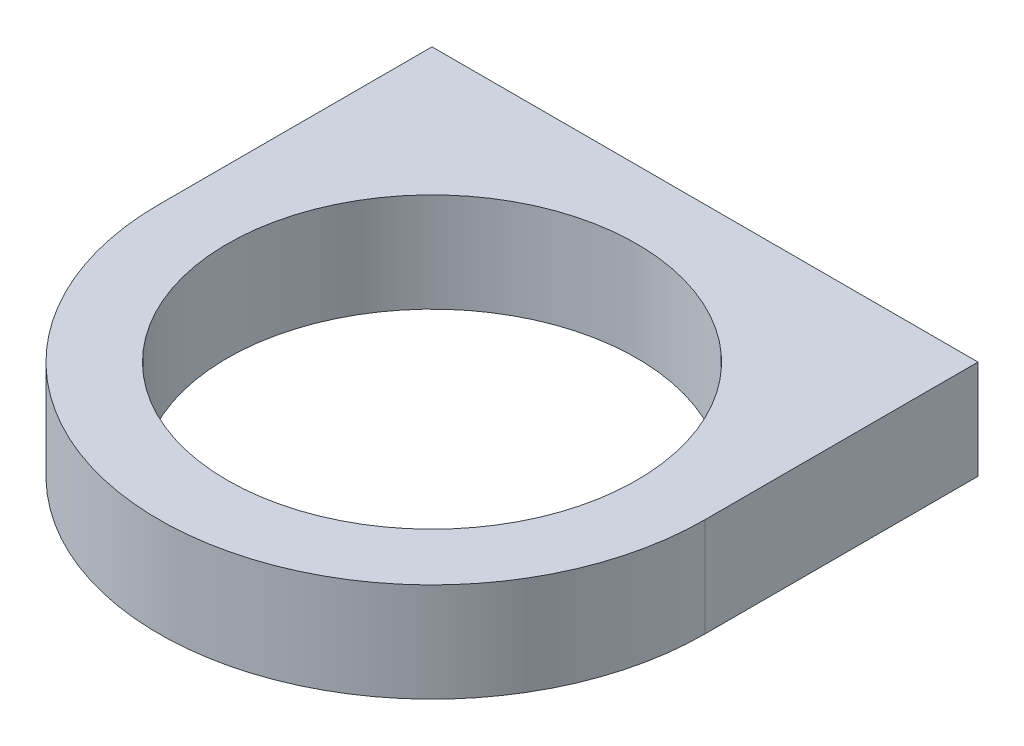
ISO-10303-21;
HEADER;
FILE_DESCRIPTION(('STEP AP214'),'2;1');
FILE_NAME('part.step','',(''),(''),'','','');
FILE_SCHEMA(('AUTOMOTIVE_DESIGN { 1 0 10303 214 1 1 1 1 }'));
ENDSEC;
DATA;
#1=APPLICATION_CONTEXT('core data for automotive mechanical design processes');
#2=APPLICATION_PROTOCOL_DEFINITION('international standard','automotive_design',2000,#1);
#3=PRODUCT_CONTEXT('',#1,'mechanical');
#4=PRODUCT('Part','Part','',(#3));
#5=PRODUCT_RELATED_PRODUCT_CATEGORY('part','',(#4));
#6=PRODUCT_DEFINITION_FORMATION('','',#4);
#7=PRODUCT_DEFINITION_CONTEXT('part definition',#1,'design');
#8=PRODUCT_DEFINITION('design','',#6,#7);
#9=PRODUCT_DEFINITION_SHAPE('','',#8);
#10=(LENGTH_UNIT() NAMED_UNIT(*) SI_UNIT(.MILLI.,.METRE.));
#11=(NAMED_UNIT(*) PLANE_ANGLE_UNIT() SI_UNIT($,.RADIAN.));
#12=(NAMED_UNIT(*) SI_UNIT($,.STERADIAN.) SOLID_ANGLE_UNIT());
#13=UNCERTAINTY_MEASURE_WITH_UNIT(LENGTH_MEASURE(1.E-05),#10,'distance_accuracy_value','');
#14=(GEOMETRIC_REPRESENTATION_CONTEXT(3) GLOBAL_UNCERTAINTY_ASSIGNED_CONTEXT((#13)) GLOBAL_UNIT_ASSIGNED_CONTEXT((#10,
#11,#12)) REPRESENTATION_CONTEXT('',''));
#15=CARTESIAN_POINT('',(0.,0.,0.));
#16=DIRECTION('',(0.,0.,1.));
#17=DIRECTION('',(1.,0.,0.));
#18=AXIS2_PLACEMENT_3D('',#15,#16,#17);
#19=CARTESIAN_POINT('',(0.,14.5,0.));
#20=DIRECTION('',(0.,-1.,0.));
#21=DIRECTION('',(0.,0.,-1.));
#22=AXIS2_PLACEMENT_3D('',#19,#20,#21);
#23=CYLINDRICAL_SURFACE('',#22,40.);
#24=CARTESIAN_POINT('',(0.,0.,0.));
#25=DIRECTION('',(0.,1.,0.));
#26=DIRECTION('',(0.,0.,1.));
#27=AXIS2_PLACEMENT_3D('',#24,#25,#26);
#28=CIRCLE('',#27,40.);
#29=CARTESIAN_POINT('',(-40.,0.,0.));
#30=VERTEX_POINT('',#29);
#31=CARTESIAN_POINT('',(40.,0.,0.));
#32=VERTEX_POINT('',#31);
#33=EDGE_CURVE('E109',#30,#32,#28,.T.);
#34=ORIENTED_EDGE('',*,*,#33,.T.);
#35=DIRECTION('',(0.,-1.,0.));
#36=VECTOR('',#35,1.);
#37=CARTESIAN_POINT('',(40.,14.5,0.));
#38=LINE('',#37,#36);
#39=CARTESIAN_POINT('',(40.,14.5,0.));
#40=VERTEX_POINT('',#39);
#41=EDGE_CURVE('E11',#40,#32,#38,.T.);
#42=ORIENTED_EDGE('',*,*,#41,.F.);
#43=CARTESIAN_POINT('',(0.,14.5,0.));
#44=DIRECTION('',(0.,1.,0.));
#45=DIRECTION('',(0.,0.,1.));
#46=AXIS2_PLACEMENT_3D('',#43,#44,#45);
#47=CIRCLE('',#46,40.);
#48=CARTESIAN_POINT('',(-40.,14.5,0.));
#49=VERTEX_POINT('',#48);
#50=EDGE_CURVE('E93',#49,#40,#47,.T.);
#51=ORIENTED_EDGE('',*,*,#50,.F.);
#52=DIRECTION('',(0.,-1.,0.));
#53=VECTOR('',#52,1.);
#54=CARTESIAN_POINT('',(-40.,14.5,0.));
#55=LINE('',#54,#53);
#56=EDGE_CURVE('E105',#49,#30,#55,.T.);
#57=ORIENTED_EDGE('',*,*,#56,.T.);
#58=EDGE_LOOP('',(#34,#42,#51,#57));
#59=FACE_BOUND('',#58,.T.);
#60=ADVANCED_FACE('F41',(#59),#23,.T.);
#61=CARTESIAN_POINT('',(40.,14.5,-40.));
#62=DIRECTION('',(-1.,0.,0.));
#63=DIRECTION('',(0.,0.,1.));
#64=AXIS2_PLACEMENT_3D('',#61,#62,#63);
#65=PLANE('',#64);
#66=DIRECTION('',(0.,0.,-1.));
#67=VECTOR('',#66,1.);
#68=CARTESIAN_POINT('',(40.,0.,-40.));
#69=LINE('',#68,#67);
#70=CARTESIAN_POINT('',(40.,0.,-40.));
#71=VERTEX_POINT('',#70);
#72=EDGE_CURVE('E98',#32,#71,#69,.T.);
#73=ORIENTED_EDGE('',*,*,#72,.T.);
#74=DIRECTION('',(0.,-1.,0.));
#75=VECTOR('',#74,1.);
#76=CARTESIAN_POINT('',(40.,14.5,-40.));
#77=LINE('',#76,#75);
#78=CARTESIAN_POINT('',(40.,14.5,-40.));
#79=VERTEX_POINT('',#78);
#80=EDGE_CURVE('E50',#79,#71,#77,.T.);
#81=ORIENTED_EDGE('',*,*,#80,.F.);
#82=DIRECTION('',(0.,0.,-1.));
#83=VECTOR('',#82,1.);
#84=CARTESIAN_POINT('',(40.,14.5,-40.));
#85=LINE('',#84,#83);
#86=EDGE_CURVE('E88',#40,#79,#85,.T.);
#87=ORIENTED_EDGE('',*,*,#86,.F.);
#88=ORIENTED_EDGE('',*,*,#41,.T.);
#89=EDGE_LOOP('',(#73,#81,#87,#88));
#90=FACE_BOUND('',#89,.T.);
#91=ADVANCED_FACE('F97',(#90),#65,.F.);
#92=CARTESIAN_POINT('',(-40.,14.5,-40.));
#93=DIRECTION('',(0.,0.,1.));
#94=DIRECTION('',(1.,0.,0.));
#95=AXIS2_PLACEMENT_3D('',#92,#93,#94);
#96=PLANE('',#95);
#97=CARTESIAN_POINT('',(35.,5.,-40.));
#98=DIRECTION('',(0.,0.,-1.));
#99=DIRECTION('',(-1.,0.,0.));
#100=AXIS2_PLACEMENT_3D('',#97,#98,#99);
#101=CIRCLE('',#100,1.35);
#102=CARTESIAN_POINT('',(33.65,5.,-40.));
#103=VERTEX_POINT('',#102);
#104=EDGE_CURVE('E155',#103,#103,#101,.T.);
#105=ORIENTED_EDGE('',*,*,#104,.F.);
#106=EDGE_LOOP('',(#105));
#107=FACE_BOUND('',#106,.T.);
#108=CARTESIAN_POINT('',(-35.,9.5,-40.));
#109=DIRECTION('',(0.,0.,-1.));
#110=DIRECTION('',(-1.,0.,0.));
#111=AXIS2_PLACEMENT_3D('',#108,#109,#110);
#112=CIRCLE('',#111,1.35);
#113=CARTESIAN_POINT('',(-36.35,9.5,-40.));
#114=VERTEX_POINT('',#113);
#115=EDGE_CURVE('E146',#114,#114,#112,.T.);
#116=ORIENTED_EDGE('',*,*,#115,.F.);
#117=EDGE_LOOP('',(#116));
#118=FACE_BOUND('',#117,.T.);
#119=CARTESIAN_POINT('',(-35.,5.,-40.));
#120=DIRECTION('',(0.,0.,-1.));
#121=DIRECTION('',(-1.,0.,0.));
#122=AXIS2_PLACEMENT_3D('',#119,#120,#121);
#123=CIRCLE('',#122,1.35);
#124=CARTESIAN_POINT('',(-36.35,5.,-40.));
#125=VERTEX_POINT('',#124);
#126=EDGE_CURVE('E162',#125,#125,#123,.T.);
#127=ORIENTED_EDGE('',*,*,#126,.F.);
#128=EDGE_LOOP('',(#127));
#129=FACE_BOUND('',#128,.T.);
#130=CARTESIAN_POINT('',(35.,9.5,-40.));
#131=DIRECTION('',(0.,0.,-1.));
#132=DIRECTION('',(-1.,0.,0.));
#133=AXIS2_PLACEMENT_3D('',#130,#131,#132);
#134=CIRCLE('',#133,1.35);
#135=CARTESIAN_POINT('',(33.65,9.5,-40.));
#136=VERTEX_POINT('',#135);
#137=EDGE_CURVE('E138',#136,#136,#134,.T.);
#138=ORIENTED_EDGE('',*,*,#137,.F.);
#139=EDGE_LOOP('',(#138));
#140=FACE_BOUND('',#139,.T.);
#141=DIRECTION('',(-1.,0.,0.));
#142=VECTOR('',#141,1.);
#143=CARTESIAN_POINT('',(-40.,0.,-40.));
#144=LINE('',#143,#142);
#145=CARTESIAN_POINT('',(-40.,0.,-40.));
#146=VERTEX_POINT('',#145);
#147=EDGE_CURVE('E75',#71,#146,#144,.T.);
#148=ORIENTED_EDGE('',*,*,#147,.T.);
#149=DIRECTION('',(0.,-1.,0.));
#150=VECTOR('',#149,1.);
#151=CARTESIAN_POINT('',(-40.,14.5,-40.));
#152=LINE('',#151,#150);
#153=CARTESIAN_POINT('',(-40.,14.5,-40.));
#154=VERTEX_POINT('',#153);
#155=EDGE_CURVE('E100',#154,#146,#152,.T.);
#156=ORIENTED_EDGE('',*,*,#155,.F.);
#157=DIRECTION('',(-1.,0.,0.));
#158=VECTOR('',#157,1.);
#159=CARTESIAN_POINT('',(-40.,14.5,-40.));
#160=LINE('',#159,#158);
#161=EDGE_CURVE('E91',#79,#154,#160,.T.);
#162=ORIENTED_EDGE('',*,*,#161,.F.);
#163=ORIENTED_EDGE('',*,*,#80,.T.);
#164=EDGE_LOOP('',(#148,#156,#162,#163));
#165=FACE_BOUND('',#164,.T.);
#166=ADVANCED_FACE('F101',(#107,#118,#129,#140,#165),#96,.F.);
#167=CARTESIAN_POINT('',(-40.,14.5,0.));
#168=DIRECTION('',(1.,0.,0.));
#169=DIRECTION('',(0.,0.,-1.));
#170=AXIS2_PLACEMENT_3D('',#167,#168,#169);
#171=PLANE('',#170);
#172=DIRECTION('',(0.,0.,1.));
#173=VECTOR('',#172,1.);
#174=CARTESIAN_POINT('',(-40.,0.,0.));
#175=LINE('',#174,#173);
#176=EDGE_CURVE('E81',#146,#30,#175,.T.);
#177=ORIENTED_EDGE('',*,*,#176,.T.);
#178=ORIENTED_EDGE('',*,*,#56,.F.);
#179=DIRECTION('',(0.,0.,1.));
#180=VECTOR('',#179,1.);
#181=CARTESIAN_POINT('',(-40.,14.5,0.));
#182=LINE('',#181,#180);
#183=EDGE_CURVE('E58',#154,#49,#182,.T.);
#184=ORIENTED_EDGE('',*,*,#183,.F.);
#185=ORIENTED_EDGE('',*,*,#155,.T.);
#186=EDGE_LOOP('',(#177,#178,#184,#185));
#187=FACE_BOUND('',#186,.T.);
#188=ADVANCED_FACE('F123',(#187),#171,.F.);
#189=CARTESIAN_POINT('',(0.,14.5,0.));
#190=DIRECTION('',(0.,1.,0.));
#191=DIRECTION('',(0.,0.,1.));
#192=AXIS2_PLACEMENT_3D('',#189,#190,#191);
#193=PLANE('',#192);
#194=CARTESIAN_POINT('',(0.,14.5,0.));
#195=DIRECTION('',(0.,1.,0.));
#196=DIRECTION('',(0.,0.,1.));
#197=AXIS2_PLACEMENT_3D('',#194,#195,#196);
#198=CIRCLE('',#197,30.);
#199=CARTESIAN_POINT('',(0.,14.5,30.));
#200=VERTEX_POINT('',#199);
#201=EDGE_CURVE('E130',#200,#200,#198,.T.);
#202=ORIENTED_EDGE('',*,*,#201,.F.);
#203=EDGE_LOOP('',(#202));
#204=FACE_BOUND('',#203,.T.);
#205=ORIENTED_EDGE('',*,*,#50,.T.);
#206=ORIENTED_EDGE('',*,*,#86,.T.);
#207=ORIENTED_EDGE('',*,*,#161,.T.);
#208=ORIENTED_EDGE('',*,*,#183,.T.);
#209=EDGE_LOOP('',(#205,#206,#207,#208));
#210=FACE_BOUND('',#209,.T.);
#211=ADVANCED_FACE('F89',(#204,#210),#193,.T.);
#212=CARTESIAN_POINT('',(0.,0.,0.));
#213=DIRECTION('',(0.,1.,0.));
#214=DIRECTION('',(0.,0.,1.));
#215=AXIS2_PLACEMENT_3D('',#212,#213,#214);
#216=PLANE('',#215);
#217=CARTESIAN_POINT('',(0.,0.,0.));
#218=DIRECTION('',(0.,1.,0.));
#219=DIRECTION('',(0.,0.,1.));
#220=AXIS2_PLACEMENT_3D('',#217,#218,#219);
#221=CIRCLE('',#220,30.);
#222=CARTESIAN_POINT('',(0.,0.,30.));
#223=VERTEX_POINT('',#222);
#224=EDGE_CURVE('E113',#223,#223,#221,.T.);
#225=ORIENTED_EDGE('',*,*,#224,.T.);
#226=EDGE_LOOP('',(#225));
#227=FACE_BOUND('',#226,.T.);
#228=ORIENTED_EDGE('',*,*,#33,.F.);
#229=ORIENTED_EDGE('',*,*,#176,.F.);
#230=ORIENTED_EDGE('',*,*,#147,.F.);
#231=ORIENTED_EDGE('',*,*,#72,.F.);
#232=EDGE_LOOP('',(#228,#229,#230,#231));
#233=FACE_BOUND('',#232,.T.);
#234=ADVANCED_FACE('F126',(#227,#233),#216,.F.);
#235=CARTESIAN_POINT('',(0.,0.,0.));
#236=DIRECTION('',(0.,1.,0.));
#237=DIRECTION('',(0.,0.,1.));
#238=AXIS2_PLACEMENT_3D('',#235,#236,#237);
#239=CYLINDRICAL_SURFACE('',#238,30.);
#240=CARTESIAN_POINT('',(0.,0.,30.));
#241=CARTESIAN_POINT('',(0.,0.151041666666667,30.));
#242=CARTESIAN_POINT('',(0.,0.302083333333333,30.));
#243=CARTESIAN_POINT('',(0.,0.604166666666667,30.));
#244=CARTESIAN_POINT('',(0.,0.755208333333333,30.));
#245=CARTESIAN_POINT('',(0.,1.05729166666667,30.));
#246=CARTESIAN_POINT('',(0.,1.20833333333333,30.));
#247=CARTESIAN_POINT('',(0.,1.51041666666667,30.));
#248=CARTESIAN_POINT('',(0.,1.66145833333333,30.));
#249=CARTESIAN_POINT('',(0.,1.96354166666667,30.));
#250=CARTESIAN_POINT('',(0.,2.11458333333333,30.));
#251=CARTESIAN_POINT('',(0.,2.41666666666667,30.));
#252=CARTESIAN_POINT('',(0.,2.56770833333333,30.));
#253=CARTESIAN_POINT('',(0.,2.86979166666667,30.));
#254=CARTESIAN_POINT('',(0.,3.02083333333333,30.));
#255=CARTESIAN_POINT('',(0.,3.32291666666667,30.));
#256=CARTESIAN_POINT('',(0.,3.47395833333333,30.));
#257=CARTESIAN_POINT('',(0.,3.77604166666667,30.));
#258=CARTESIAN_POINT('',(0.,3.92708333333333,30.));
#259=CARTESIAN_POINT('',(0.,4.22916666666667,30.));
#260=CARTESIAN_POINT('',(0.,4.38020833333333,30.));
#261=CARTESIAN_POINT('',(0.,4.68229166666667,30.));
#262=CARTESIAN_POINT('',(0.,4.83333333333333,30.));
#263=CARTESIAN_POINT('',(0.,5.13541666666667,30.));
#264=CARTESIAN_POINT('',(0.,5.28645833333333,30.));
#265=CARTESIAN_POINT('',(0.,5.58854166666667,30.));
#266=CARTESIAN_POINT('',(0.,5.73958333333333,30.));
#267=CARTESIAN_POINT('',(0.,6.04166666666667,30.));
#268=CARTESIAN_POINT('',(0.,6.19270833333333,30.));
#269=CARTESIAN_POINT('',(0.,6.49479166666667,30.));
#270=CARTESIAN_POINT('',(0.,6.64583333333333,30.));
#271=CARTESIAN_POINT('',(0.,6.94791666666667,30.));
#272=CARTESIAN_POINT('',(0.,7.09895833333333,30.));
#273=CARTESIAN_POINT('',(0.,7.40104166666667,30.));
#274=CARTESIAN_POINT('',(0.,7.55208333333333,30.));
#275=CARTESIAN_POINT('',(0.,7.85416666666667,30.));
#276=CARTESIAN_POINT('',(0.,8.00520833333333,30.));
#277=CARTESIAN_POINT('',(0.,8.30729166666667,30.));
#278=CARTESIAN_POINT('',(0.,8.45833333333333,30.));
#279=CARTESIAN_POINT('',(0.,8.76041666666667,30.));
#280=CARTESIAN_POINT('',(0.,8.91145833333333,30.));
#281=CARTESIAN_POINT('',(0.,9.21354166666667,30.));
#282=CARTESIAN_POINT('',(0.,9.36458333333333,30.));
#283=CARTESIAN_POINT('',(0.,9.66666666666667,30.));
#284=CARTESIAN_POINT('',(0.,9.81770833333333,30.));
#285=CARTESIAN_POINT('',(0.,10.1197916666667,30.));
#286=CARTESIAN_POINT('',(0.,10.2708333333333,30.));
#287=CARTESIAN_POINT('',(0.,10.5729166666667,30.));
#288=CARTESIAN_POINT('',(0.,10.7239583333333,30.));
#289=CARTESIAN_POINT('',(0.,11.0260416666667,30.));
#290=CARTESIAN_POINT('',(0.,11.1770833333333,30.));
#291=CARTESIAN_POINT('',(0.,11.4791666666667,30.));
#292=CARTESIAN_POINT('',(0.,11.6302083333333,30.));
#293=CARTESIAN_POINT('',(0.,11.9322916666667,30.));
#294=CARTESIAN_POINT('',(0.,12.0833333333333,30.));
#295=CARTESIAN_POINT('',(0.,12.3854166666667,30.));
#296=CARTESIAN_POINT('',(0.,12.5364583333333,30.));
#297=CARTESIAN_POINT('',(0.,12.8385416666667,30.));
#298=CARTESIAN_POINT('',(0.,12.9895833333333,30.));
#299=CARTESIAN_POINT('',(0.,13.2916666666667,30.));
#300=CARTESIAN_POINT('',(0.,13.4427083333333,30.));
#301=CARTESIAN_POINT('',(0.,13.7447916666667,30.));
#302=CARTESIAN_POINT('',(0.,13.8958333333333,30.));
#303=CARTESIAN_POINT('',(0.,14.1979166666667,30.));
#304=CARTESIAN_POINT('',(0.,14.3489583333333,30.));
#305=CARTESIAN_POINT('',(0.,14.5,30.));
#306=B_SPLINE_CURVE_WITH_KNOTS('',3,(#240,#241,#242,#243,#244,#245,#246,#247,#248,#249,#250,
#251,#252,#253,#254,#255,#256,#257,#258,#259,#260,#261,#262,#263,#264,#265,#266,#267,#268,#269,
#270,#271,#272,#273,#274,#275,#276,#277,#278,#279,#280,#281,#282,#283,#284,#285,#286,#287,#288,
#289,#290,#291,#292,#293,#294,#295,#296,#297,#298,#299,#300,#301,#302,#303,#304,#305),
.UNSPECIFIED.,.F.,.F.,(4,2,2,2,2,2,2,2,2,2,2,2,2,2,2,2,2,2,2,2,2,2,2,2,2,2,2,2,2,2,2,2,4),(0.,
0.453125,0.90625,1.359375,1.8125,2.265625,2.71875,3.171875,3.625,4.078125,4.53125,4.984375,
5.4375,5.890625,6.34375,6.796875,7.25,7.703125,8.15625,8.609375,9.0625,9.515625,9.96875,
10.421875,10.875,11.328125,11.78125,12.234375,12.6875,13.140625,13.59375,14.046875,14.5),.UNSPECIFIED.);
#307=EDGE_CURVE('BSEAM187',#223,#200,#306,.T.);
#308=ORIENTED_EDGE('',*,*,#224,.F.);
#309=ORIENTED_EDGE('',*,*,#201,.T.);
#310=ORIENTED_EDGE('',*,*,#307,.T.);
#311=ORIENTED_EDGE('',*,*,#307,.F.);
#312=EDGE_LOOP('',(#308,#310,#309,#311));
#313=FACE_BOUND('',#312,.T.);
#314=ADVANCED_FACE('F187',(#313),#239,.F.);
#315=CARTESIAN_POINT('',(35.,9.5,-10.));
#316=DIRECTION('',(0.,0.,-1.));
#317=DIRECTION('',(-1.,0.,0.));
#318=AXIS2_PLACEMENT_3D('',#315,#316,#317);
#319=CYLINDRICAL_SURFACE('',#318,1.35);
#320=CARTESIAN_POINT('',(35.,9.5,-10.));
#321=DIRECTION('',(0.,0.,-1.));
#322=DIRECTION('',(-1.,0.,0.));
#323=AXIS2_PLACEMENT_3D('',#320,#321,#322);
#324=CIRCLE('',#323,1.35);
#325=CARTESIAN_POINT('',(33.65,9.5,-10.));
#326=VERTEX_POINT('',#325);
#327=EDGE_CURVE('E134',#326,#326,#324,.T.);
#328=ORIENTED_EDGE('',*,*,#327,.F.);
#329=EDGE_LOOP('',(#328));
#330=FACE_BOUND('',#329,.T.);
#331=ORIENTED_EDGE('',*,*,#137,.T.);
#332=EDGE_LOOP('',(#331));
#333=FACE_BOUND('',#332,.T.);
#334=ADVANCED_FACE('F185',(#330,#333),#319,.F.);
#335=CARTESIAN_POINT('',(35.,9.5,-10.));
#336=DIRECTION('',(0.,0.,-1.));
#337=DIRECTION('',(-1.,0.,0.));
#338=AXIS2_PLACEMENT_3D('',#335,#336,#337);
#339=PLANE('',#338);
#340=ORIENTED_EDGE('',*,*,#327,.T.);
#341=EDGE_LOOP('',(#340));
#342=FACE_BOUND('',#341,.T.);
#343=ADVANCED_FACE('F175',(#342),#339,.T.);
#344=CARTESIAN_POINT('',(-35.,5.,-10.));
#345=DIRECTION('',(0.,0.,-1.));
#346=DIRECTION('',(-1.,0.,0.));
#347=AXIS2_PLACEMENT_3D('',#344,#345,#346);
#348=CYLINDRICAL_SURFACE('',#347,1.35);
#349=CARTESIAN_POINT('',(-35.,5.,-10.));
#350=DIRECTION('',(0.,0.,-1.));
#351=DIRECTION('',(-1.,0.,0.));
#352=AXIS2_PLACEMENT_3D('',#349,#350,#351);
#353=CIRCLE('',#352,1.35);
#354=CARTESIAN_POINT('',(-36.35,5.,-10.));
#355=VERTEX_POINT('',#354);
#356=EDGE_CURVE('E151',#355,#355,#353,.T.);
#357=ORIENTED_EDGE('',*,*,#356,.F.);
#358=EDGE_LOOP('',(#357));
#359=FACE_BOUND('',#358,.T.);
#360=ORIENTED_EDGE('',*,*,#126,.T.);
#361=EDGE_LOOP('',(#360));
#362=FACE_BOUND('',#361,.T.);
#363=ADVANCED_FACE('F172',(#359,#362),#348,.F.);
#364=CARTESIAN_POINT('',(-35.,5.,-10.));
#365=DIRECTION('',(0.,0.,-1.));
#366=DIRECTION('',(-1.,0.,0.));
#367=AXIS2_PLACEMENT_3D('',#364,#365,#366);
#368=PLANE('',#367);
#369=ORIENTED_EDGE('',*,*,#356,.T.);
#370=EDGE_LOOP('',(#369));
#371=FACE_BOUND('',#370,.T.);
#372=ADVANCED_FACE('F170',(#371),#368,.T.);
#373=CARTESIAN_POINT('',(-35.,9.5,-10.));
#374=DIRECTION('',(0.,0.,-1.));
#375=DIRECTION('',(-1.,0.,0.));
#376=AXIS2_PLACEMENT_3D('',#373,#374,#375);
#377=CYLINDRICAL_SURFACE('',#376,1.35);
#378=CARTESIAN_POINT('',(-35.,9.5,-10.));
#379=DIRECTION('',(0.,0.,-1.));
#380=DIRECTION('',(-1.,0.,0.));
#381=AXIS2_PLACEMENT_3D('',#378,#379,#380);
#382=CIRCLE('',#381,1.35);
#383=CARTESIAN_POINT('',(-36.35,9.5,-10.));
#384=VERTEX_POINT('',#383);
#385=EDGE_CURVE('E150',#384,#384,#382,.T.);
#386=ORIENTED_EDGE('',*,*,#385,.F.);
#387=EDGE_LOOP('',(#386));
#388=FACE_BOUND('',#387,.T.);
#389=ORIENTED_EDGE('',*,*,#115,.T.);
#390=EDGE_LOOP('',(#389));
#391=FACE_BOUND('',#390,.T.);
#392=ADVANCED_FACE('F260',(#388,#391),#377,.F.);
#393=CARTESIAN_POINT('',(-35.,9.5,-10.));
#394=DIRECTION('',(0.,0.,-1.));
#395=DIRECTION('',(-1.,0.,0.));
#396=AXIS2_PLACEMENT_3D('',#393,#394,#395);
#397=PLANE('',#396);
#398=ORIENTED_EDGE('',*,*,#385,.T.);
#399=EDGE_LOOP('',(#398));
#400=FACE_BOUND('',#399,.T.);
#401=ADVANCED_FACE('F269',(#400),#397,.T.);
#402=CARTESIAN_POINT('',(35.,5.,-10.));
#403=DIRECTION('',(0.,0.,-1.));
#404=DIRECTION('',(-1.,0.,0.));
#405=AXIS2_PLACEMENT_3D('',#402,#403,#404);
#406=CYLINDRICAL_SURFACE('',#405,1.35);
#407=CARTESIAN_POINT('',(35.,5.,-10.));
#408=DIRECTION('',(0.,0.,-1.));
#409=DIRECTION('',(-1.,0.,0.));
#410=AXIS2_PLACEMENT_3D('',#407,#408,#409);
#411=CIRCLE('',#410,1.35);
#412=CARTESIAN_POINT('',(33.65,5.,-10.));
#413=VERTEX_POINT('',#412);
#414=EDGE_CURVE('E142',#413,#413,#411,.T.);
#415=ORIENTED_EDGE('',*,*,#414,.F.);
#416=EDGE_LOOP('',(#415));
#417=FACE_BOUND('',#416,.T.);
#418=ORIENTED_EDGE('',*,*,#104,.T.);
#419=EDGE_LOOP('',(#418));
#420=FACE_BOUND('',#419,.T.);
#421=ADVANCED_FACE('F279',(#417,#420),#406,.F.);
#422=CARTESIAN_POINT('',(35.,5.,-10.));
#423=DIRECTION('',(0.,0.,-1.));
#424=DIRECTION('',(-1.,0.,0.));
#425=AXIS2_PLACEMENT_3D('',#422,#423,#424);
#426=PLANE('',#425);
#427=ORIENTED_EDGE('',*,*,#414,.T.);
#428=EDGE_LOOP('',(#427));
#429=FACE_BOUND('',#428,.T.);
#430=ADVANCED_FACE('F289',(#429),#426,.T.);
#431=CLOSED_SHELL('',(#60,#91,#166,#188,#211,#234,#314,#334,#343,#363,#372,#392,#401,#421,#430));
#432=MANIFOLD_SOLID_BREP('B2',#431);
#433=ADVANCED_BREP_SHAPE_REPRESENTATION('',(#18,#432),#14);
#434=SHAPE_DEFINITION_REPRESENTATION(#9,#433);
ENDSEC;
END-ISO-10303-21;
